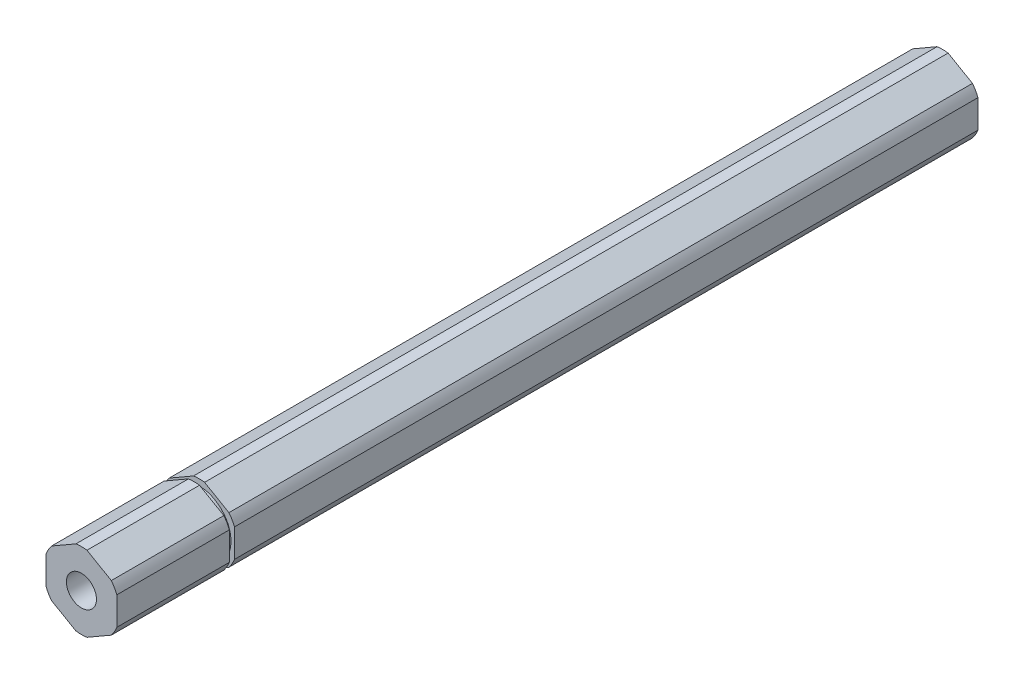
ISO-10303-21;
HEADER;
FILE_DESCRIPTION(('STEP AP214'),'2;1');
FILE_NAME('part.step','',(''),(''),'','','');
FILE_SCHEMA(('AUTOMOTIVE_DESIGN { 1 0 10303 214 1 1 1 1 }'));
ENDSEC;
DATA;
#1=APPLICATION_CONTEXT('core data for automotive mechanical design processes');
#2=APPLICATION_PROTOCOL_DEFINITION('international standard','automotive_design',2000,#1);
#3=PRODUCT_CONTEXT('',#1,'mechanical');
#4=PRODUCT('Part','Part','',(#3));
#5=PRODUCT_RELATED_PRODUCT_CATEGORY('part','',(#4));
#6=PRODUCT_DEFINITION_FORMATION('','',#4);
#7=PRODUCT_DEFINITION_CONTEXT('part definition',#1,'design');
#8=PRODUCT_DEFINITION('design','',#6,#7);
#9=PRODUCT_DEFINITION_SHAPE('','',#8);
#10=(LENGTH_UNIT() NAMED_UNIT(*) SI_UNIT(.MILLI.,.METRE.));
#11=(NAMED_UNIT(*) PLANE_ANGLE_UNIT() SI_UNIT($,.RADIAN.));
#12=(NAMED_UNIT(*) SI_UNIT($,.STERADIAN.) SOLID_ANGLE_UNIT());
#13=UNCERTAINTY_MEASURE_WITH_UNIT(LENGTH_MEASURE(1.E-05),#10,'distance_accuracy_value','');
#14=(GEOMETRIC_REPRESENTATION_CONTEXT(3) GLOBAL_UNCERTAINTY_ASSIGNED_CONTEXT((#13)) GLOBAL_UNIT_ASSIGNED_CONTEXT((#10,
#11,#12)) REPRESENTATION_CONTEXT('',''));
#15=CARTESIAN_POINT('',(0.,0.,0.));
#16=DIRECTION('',(0.,0.,1.));
#17=DIRECTION('',(1.,0.,0.));
#18=AXIS2_PLACEMENT_3D('',#15,#16,#17);
#19=CARTESIAN_POINT('',(4.7625,0.,57.88025));
#20=DIRECTION('',(-1.,0.,0.));
#21=DIRECTION('',(0.,-1.,0.));
#22=AXIS2_PLACEMENT_3D('',#19,#20,#21);
#23=PLANE('',#22);
#24=DIRECTION('',(0.,-1.,0.));
#25=VECTOR('',#24,1.);
#26=CARTESIAN_POINT('',(4.7625,0.,42.75455));
#27=LINE('',#26,#25);
#28=CARTESIAN_POINT('',(4.7625,1.89171391930704,42.75455));
#29=VERTEX_POINT('',#28);
#30=CARTESIAN_POINT('',(4.7625,-1.89171391930704,42.75455));
#31=VERTEX_POINT('',#30);
#32=EDGE_CURVE('E59',#29,#31,#27,.T.);
#33=ORIENTED_EDGE('',*,*,#32,.F.);
#34=DIRECTION('',(0.,0.,-1.));
#35=VECTOR('',#34,1.);
#36=CARTESIAN_POINT('',(4.7625,1.89171391930704,57.88025));
#37=LINE('',#36,#35);
#38=CARTESIAN_POINT('',(4.7625,1.89171391930704,57.88025));
#39=VERTEX_POINT('',#38);
#40=EDGE_CURVE('E201',#39,#29,#37,.T.);
#41=ORIENTED_EDGE('',*,*,#40,.F.);
#42=DIRECTION('',(0.,1.,0.));
#43=VECTOR('',#42,1.);
#44=CARTESIAN_POINT('',(4.7625,0.,57.88025));
#45=LINE('',#44,#43);
#46=CARTESIAN_POINT('',(4.7625,-1.89171391930704,57.88025));
#47=VERTEX_POINT('',#46);
#48=EDGE_CURVE('E372',#47,#39,#45,.T.);
#49=ORIENTED_EDGE('',*,*,#48,.F.);
#50=DIRECTION('',(0.,0.,-1.));
#51=VECTOR('',#50,1.);
#52=CARTESIAN_POINT('',(4.7625,-1.89171391930704,57.88025));
#53=LINE('',#52,#51);
#54=EDGE_CURVE('E215',#47,#31,#53,.T.);
#55=ORIENTED_EDGE('',*,*,#54,.T.);
#56=EDGE_LOOP('',(#33,#41,#49,#55));
#57=FACE_BOUND('',#56,.T.);
#58=ADVANCED_FACE('F37',(#57),#23,.F.);
#59=CARTESIAN_POINT('',(0.,0.,57.88025));
#60=DIRECTION('',(0.,0.,-1.));
#61=DIRECTION('',(-1.,0.,0.));
#62=AXIS2_PLACEMENT_3D('',#59,#60,#61);
#63=CYLINDRICAL_SURFACE('',#62,5.12445);
#64=CARTESIAN_POINT('',(0.,0.,42.75455));
#65=DIRECTION('',(0.,0.,-1.));
#66=DIRECTION('',(-1.,0.,0.));
#67=AXIS2_PLACEMENT_3D('',#64,#65,#66);
#68=CIRCLE('',#67,5.12445);
#69=CARTESIAN_POINT('',(4.01952231081252,3.17858902586987,42.75455));
#70=VERTEX_POINT('',#69);
#71=EDGE_CURVE('E361',#70,#29,#68,.T.);
#72=ORIENTED_EDGE('',*,*,#71,.F.);
#73=DIRECTION('',(0.,0.,-1.));
#74=VECTOR('',#73,1.);
#75=CARTESIAN_POINT('',(4.01952231081252,3.17858902586987,57.88025));
#76=LINE('',#75,#74);
#77=CARTESIAN_POINT('',(4.01952231081252,3.17858902586987,57.88025));
#78=VERTEX_POINT('',#77);
#79=EDGE_CURVE('E264',#78,#70,#76,.T.);
#80=ORIENTED_EDGE('',*,*,#79,.F.);
#81=CARTESIAN_POINT('',(0.,0.,57.88025));
#82=DIRECTION('',(0.,0.,1.));
#83=DIRECTION('',(1.,0.,0.));
#84=AXIS2_PLACEMENT_3D('',#81,#82,#83);
#85=CIRCLE('',#84,5.12445);
#86=EDGE_CURVE('E223',#39,#78,#85,.T.);
#87=ORIENTED_EDGE('',*,*,#86,.F.);
#88=ORIENTED_EDGE('',*,*,#40,.T.);
#89=EDGE_LOOP('',(#72,#80,#87,#88));
#90=FACE_BOUND('',#89,.T.);
#91=ADVANCED_FACE('F435',(#90),#63,.T.);
#92=CARTESIAN_POINT('',(2.38125,4.12444598552339,57.88025));
#93=DIRECTION('',(-0.5,-0.866025403784439,0.));
#94=DIRECTION('',(0.866025403784439,-0.5,0.));
#95=AXIS2_PLACEMENT_3D('',#92,#93,#94);
#96=PLANE('',#95);
#97=DIRECTION('',(0.866025403784439,-0.5,0.));
#98=VECTOR('',#97,1.);
#99=CARTESIAN_POINT('',(2.38125,4.12444598552339,42.75455));
#100=LINE('',#99,#98);
#101=CARTESIAN_POINT('',(0.742977689187476,5.07030294517691,42.75455));
#102=VERTEX_POINT('',#101);
#103=EDGE_CURVE('E359',#102,#70,#100,.T.);
#104=ORIENTED_EDGE('',*,*,#103,.F.);
#105=DIRECTION('',(0.,0.,-1.));
#106=VECTOR('',#105,1.);
#107=CARTESIAN_POINT('',(0.742977689187476,5.07030294517691,57.88025));
#108=LINE('',#107,#106);
#109=CARTESIAN_POINT('',(0.742977689187476,5.07030294517691,57.88025));
#110=VERTEX_POINT('',#109);
#111=EDGE_CURVE('E260',#110,#102,#108,.T.);
#112=ORIENTED_EDGE('',*,*,#111,.F.);
#113=DIRECTION('',(-0.866025403784439,0.5,0.));
#114=VECTOR('',#113,1.);
#115=CARTESIAN_POINT('',(2.38125,4.12444598552339,57.88025));
#116=LINE('',#115,#114);
#117=EDGE_CURVE('E375',#78,#110,#116,.T.);
#118=ORIENTED_EDGE('',*,*,#117,.F.);
#119=ORIENTED_EDGE('',*,*,#79,.T.);
#120=EDGE_LOOP('',(#104,#112,#118,#119));
#121=FACE_BOUND('',#120,.T.);
#122=ADVANCED_FACE('F438',(#121),#96,.F.);
#123=CARTESIAN_POINT('',(0.,0.,42.75455));
#124=DIRECTION('',(0.,0.,-1.));
#125=DIRECTION('',(-1.,0.,0.));
#126=AXIS2_PLACEMENT_3D('',#123,#124,#125);
#127=CIRCLE('',#126,5.12445);
#128=CARTESIAN_POINT('',(-0.742977689187478,5.07030294517691,42.75455));
#129=VERTEX_POINT('',#128);
#130=EDGE_CURVE('E357',#129,#102,#127,.T.);
#131=ORIENTED_EDGE('',*,*,#130,.F.);
#132=DIRECTION('',(0.,0.,-1.));
#133=VECTOR('',#132,1.);
#134=CARTESIAN_POINT('',(-0.742977689187479,5.07030294517691,57.88025));
#135=LINE('',#134,#133);
#136=CARTESIAN_POINT('',(-0.742977689187479,5.07030294517691,57.88025));
#137=VERTEX_POINT('',#136);
#138=EDGE_CURVE('E256',#137,#129,#135,.T.);
#139=ORIENTED_EDGE('',*,*,#138,.F.);
#140=EDGE_CURVE('E376',#110,#137,#85,.T.);
#141=ORIENTED_EDGE('',*,*,#140,.F.);
#142=ORIENTED_EDGE('',*,*,#111,.T.);
#143=EDGE_LOOP('',(#131,#139,#141,#142));
#144=FACE_BOUND('',#143,.T.);
#145=ADVANCED_FACE('F400',(#144),#63,.T.);
#146=CARTESIAN_POINT('',(-2.38125,4.12444598552339,57.88025));
#147=DIRECTION('',(0.5,-0.866025403784438,0.));
#148=DIRECTION('',(0.866025403784439,0.5,0.));
#149=AXIS2_PLACEMENT_3D('',#146,#147,#148);
#150=PLANE('',#149);
#151=DIRECTION('',(0.866025403784439,0.5,0.));
#152=VECTOR('',#151,1.);
#153=CARTESIAN_POINT('',(-2.38125,4.12444598552339,42.75455));
#154=LINE('',#153,#152);
#155=CARTESIAN_POINT('',(-4.01952231081252,3.17858902586987,42.75455));
#156=VERTEX_POINT('',#155);
#157=EDGE_CURVE('E355',#156,#129,#154,.T.);
#158=ORIENTED_EDGE('',*,*,#157,.F.);
#159=DIRECTION('',(0.,0.,-1.));
#160=VECTOR('',#159,1.);
#161=CARTESIAN_POINT('',(-4.01952231081252,3.17858902586987,57.88025));
#162=LINE('',#161,#160);
#163=CARTESIAN_POINT('',(-4.01952231081252,3.17858902586987,57.88025));
#164=VERTEX_POINT('',#163);
#165=EDGE_CURVE('E252',#164,#156,#162,.T.);
#166=ORIENTED_EDGE('',*,*,#165,.F.);
#167=DIRECTION('',(-0.866025403784438,-0.5,0.));
#168=VECTOR('',#167,1.);
#169=CARTESIAN_POINT('',(-2.38125,4.12444598552339,57.88025));
#170=LINE('',#169,#168);
#171=EDGE_CURVE('E378',#137,#164,#170,.T.);
#172=ORIENTED_EDGE('',*,*,#171,.F.);
#173=ORIENTED_EDGE('',*,*,#138,.T.);
#174=EDGE_LOOP('',(#158,#166,#172,#173));
#175=FACE_BOUND('',#174,.T.);
#176=ADVANCED_FACE('F403',(#175),#150,.F.);
#177=CARTESIAN_POINT('',(0.,0.,42.75455));
#178=DIRECTION('',(0.,0.,-1.));
#179=DIRECTION('',(-1.,0.,0.));
#180=AXIS2_PLACEMENT_3D('',#177,#178,#179);
#181=CIRCLE('',#180,5.12445);
#182=CARTESIAN_POINT('',(-4.7625,1.89171391930703,42.75455));
#183=VERTEX_POINT('',#182);
#184=EDGE_CURVE('E353',#183,#156,#181,.T.);
#185=ORIENTED_EDGE('',*,*,#184,.F.);
#186=DIRECTION('',(0.,0.,-1.));
#187=VECTOR('',#186,1.);
#188=CARTESIAN_POINT('',(-4.7625,1.89171391930703,57.88025));
#189=LINE('',#188,#187);
#190=CARTESIAN_POINT('',(-4.7625,1.89171391930703,57.88025));
#191=VERTEX_POINT('',#190);
#192=EDGE_CURVE('E248',#191,#183,#189,.T.);
#193=ORIENTED_EDGE('',*,*,#192,.F.);
#194=EDGE_CURVE('E380',#164,#191,#85,.T.);
#195=ORIENTED_EDGE('',*,*,#194,.F.);
#196=ORIENTED_EDGE('',*,*,#165,.T.);
#197=EDGE_LOOP('',(#185,#193,#195,#196));
#198=FACE_BOUND('',#197,.T.);
#199=ADVANCED_FACE('F406',(#198),#63,.T.);
#200=CARTESIAN_POINT('',(-4.7625,0.,57.88025));
#201=DIRECTION('',(1.,0.,0.));
#202=DIRECTION('',(0.,1.,0.));
#203=AXIS2_PLACEMENT_3D('',#200,#201,#202);
#204=PLANE('',#203);
#205=DIRECTION('',(0.,1.,0.));
#206=VECTOR('',#205,1.);
#207=CARTESIAN_POINT('',(-4.7625,0.,42.75455));
#208=LINE('',#207,#206);
#209=CARTESIAN_POINT('',(-4.7625,-1.89171391930704,42.75455));
#210=VERTEX_POINT('',#209);
#211=EDGE_CURVE('E351',#210,#183,#208,.T.);
#212=ORIENTED_EDGE('',*,*,#211,.F.);
#213=DIRECTION('',(0.,0.,-1.));
#214=VECTOR('',#213,1.);
#215=CARTESIAN_POINT('',(-4.7625,-1.89171391930704,57.88025));
#216=LINE('',#215,#214);
#217=CARTESIAN_POINT('',(-4.7625,-1.89171391930704,57.88025));
#218=VERTEX_POINT('',#217);
#219=EDGE_CURVE('E244',#218,#210,#216,.T.);
#220=ORIENTED_EDGE('',*,*,#219,.F.);
#221=DIRECTION('',(0.,-1.,0.));
#222=VECTOR('',#221,1.);
#223=CARTESIAN_POINT('',(-4.7625,0.,57.88025));
#224=LINE('',#223,#222);
#225=EDGE_CURVE('E381',#191,#218,#224,.T.);
#226=ORIENTED_EDGE('',*,*,#225,.F.);
#227=ORIENTED_EDGE('',*,*,#192,.T.);
#228=EDGE_LOOP('',(#212,#220,#226,#227));
#229=FACE_BOUND('',#228,.T.);
#230=ADVANCED_FACE('F411',(#229),#204,.F.);
#231=CARTESIAN_POINT('',(0.,0.,42.75455));
#232=DIRECTION('',(0.,0.,-1.));
#233=DIRECTION('',(-1.,0.,0.));
#234=AXIS2_PLACEMENT_3D('',#231,#232,#233);
#235=CIRCLE('',#234,5.12445);
#236=CARTESIAN_POINT('',(-4.01952231081252,-3.17858902586988,42.75455));
#237=VERTEX_POINT('',#236);
#238=EDGE_CURVE('E349',#237,#210,#235,.T.);
#239=ORIENTED_EDGE('',*,*,#238,.F.);
#240=DIRECTION('',(0.,0.,-1.));
#241=VECTOR('',#240,1.);
#242=CARTESIAN_POINT('',(-4.01952231081252,-3.17858902586988,57.88025));
#243=LINE('',#242,#241);
#244=CARTESIAN_POINT('',(-4.01952231081252,-3.17858902586988,57.88025));
#245=VERTEX_POINT('',#244);
#246=EDGE_CURVE('E240',#245,#237,#243,.T.);
#247=ORIENTED_EDGE('',*,*,#246,.F.);
#248=EDGE_CURVE('E382',#218,#245,#85,.T.);
#249=ORIENTED_EDGE('',*,*,#248,.F.);
#250=ORIENTED_EDGE('',*,*,#219,.T.);
#251=EDGE_LOOP('',(#239,#247,#249,#250));
#252=FACE_BOUND('',#251,.T.);
#253=ADVANCED_FACE('F414',(#252),#63,.T.);
#254=CARTESIAN_POINT('',(-2.38125,-4.12444598552339,57.88025));
#255=DIRECTION('',(0.5,0.866025403784439,0.));
#256=DIRECTION('',(-0.866025403784439,0.5,0.));
#257=AXIS2_PLACEMENT_3D('',#254,#255,#256);
#258=PLANE('',#257);
#259=DIRECTION('',(-0.866025403784439,0.5,0.));
#260=VECTOR('',#259,1.);
#261=CARTESIAN_POINT('',(-2.38125,-4.12444598552339,42.75455));
#262=LINE('',#261,#260);
#263=CARTESIAN_POINT('',(-0.742977689187483,-5.07030294517691,42.75455));
#264=VERTEX_POINT('',#263);
#265=EDGE_CURVE('E347',#264,#237,#262,.T.);
#266=ORIENTED_EDGE('',*,*,#265,.F.);
#267=DIRECTION('',(0.,0.,-1.));
#268=VECTOR('',#267,1.);
#269=CARTESIAN_POINT('',(-0.742977689187483,-5.07030294517691,57.88025));
#270=LINE('',#269,#268);
#271=CARTESIAN_POINT('',(-0.742977689187483,-5.07030294517691,57.88025));
#272=VERTEX_POINT('',#271);
#273=EDGE_CURVE('E236',#272,#264,#270,.T.);
#274=ORIENTED_EDGE('',*,*,#273,.F.);
#275=DIRECTION('',(0.866025403784439,-0.5,0.));
#276=VECTOR('',#275,1.);
#277=CARTESIAN_POINT('',(-2.38125,-4.12444598552339,57.88025));
#278=LINE('',#277,#276);
#279=EDGE_CURVE('E383',#245,#272,#278,.T.);
#280=ORIENTED_EDGE('',*,*,#279,.F.);
#281=ORIENTED_EDGE('',*,*,#246,.T.);
#282=EDGE_LOOP('',(#266,#274,#280,#281));
#283=FACE_BOUND('',#282,.T.);
#284=ADVANCED_FACE('F417',(#283),#258,.F.);
#285=CARTESIAN_POINT('',(0.,0.,42.75455));
#286=DIRECTION('',(0.,0.,-1.));
#287=DIRECTION('',(-1.,0.,0.));
#288=AXIS2_PLACEMENT_3D('',#285,#286,#287);
#289=CIRCLE('',#288,5.12445);
#290=CARTESIAN_POINT('',(0.742977689187482,-5.07030294517691,42.75455));
#291=VERTEX_POINT('',#290);
#292=EDGE_CURVE('E345',#291,#264,#289,.T.);
#293=ORIENTED_EDGE('',*,*,#292,.F.);
#294=DIRECTION('',(0.,0.,-1.));
#295=VECTOR('',#294,1.);
#296=CARTESIAN_POINT('',(0.742977689187482,-5.07030294517691,57.88025));
#297=LINE('',#296,#295);
#298=CARTESIAN_POINT('',(0.742977689187482,-5.07030294517691,57.88025));
#299=VERTEX_POINT('',#298);
#300=EDGE_CURVE('E232',#299,#291,#297,.T.);
#301=ORIENTED_EDGE('',*,*,#300,.F.);
#302=EDGE_CURVE('E222',#272,#299,#85,.T.);
#303=ORIENTED_EDGE('',*,*,#302,.F.);
#304=ORIENTED_EDGE('',*,*,#273,.T.);
#305=EDGE_LOOP('',(#293,#301,#303,#304));
#306=FACE_BOUND('',#305,.T.);
#307=ADVANCED_FACE('F422',(#306),#63,.T.);
#308=CARTESIAN_POINT('',(2.38125,-4.12444598552339,57.88025));
#309=DIRECTION('',(-0.5,0.866025403784438,0.));
#310=DIRECTION('',(-0.866025403784438,-0.500000000000001,0.));
#311=AXIS2_PLACEMENT_3D('',#308,#309,#310);
#312=PLANE('',#311);
#313=DIRECTION('',(-0.866025403784438,-0.500000000000001,0.));
#314=VECTOR('',#313,1.);
#315=CARTESIAN_POINT('',(2.38125,-4.12444598552339,42.75455));
#316=LINE('',#315,#314);
#317=CARTESIAN_POINT('',(4.01952231081252,-3.17858902586987,42.75455));
#318=VERTEX_POINT('',#317);
#319=EDGE_CURVE('E208',#318,#291,#316,.T.);
#320=ORIENTED_EDGE('',*,*,#319,.F.);
#321=DIRECTION('',(0.,0.,-1.));
#322=VECTOR('',#321,1.);
#323=CARTESIAN_POINT('',(4.01952231081252,-3.17858902586987,57.88025));
#324=LINE('',#323,#322);
#325=CARTESIAN_POINT('',(4.01952231081252,-3.17858902586987,57.88025));
#326=VERTEX_POINT('',#325);
#327=EDGE_CURVE('E228',#326,#318,#324,.T.);
#328=ORIENTED_EDGE('',*,*,#327,.F.);
#329=DIRECTION('',(0.866025403784438,0.500000000000001,0.));
#330=VECTOR('',#329,1.);
#331=CARTESIAN_POINT('',(2.38125,-4.12444598552339,57.88025));
#332=LINE('',#331,#330);
#333=EDGE_CURVE('E220',#299,#326,#332,.T.);
#334=ORIENTED_EDGE('',*,*,#333,.F.);
#335=ORIENTED_EDGE('',*,*,#300,.T.);
#336=EDGE_LOOP('',(#320,#328,#334,#335));
#337=FACE_BOUND('',#336,.T.);
#338=ADVANCED_FACE('F429',(#337),#312,.F.);
#339=CARTESIAN_POINT('',(0.,0.,42.75455));
#340=DIRECTION('',(0.,0.,-1.));
#341=DIRECTION('',(-1.,0.,0.));
#342=AXIS2_PLACEMENT_3D('',#339,#340,#341);
#343=CIRCLE('',#342,5.12445);
#344=EDGE_CURVE('E11',#31,#318,#343,.T.);
#345=ORIENTED_EDGE('',*,*,#344,.F.);
#346=ORIENTED_EDGE('',*,*,#54,.F.);
#347=EDGE_CURVE('E216',#326,#47,#85,.T.);
#348=ORIENTED_EDGE('',*,*,#347,.F.);
#349=ORIENTED_EDGE('',*,*,#327,.T.);
#350=EDGE_LOOP('',(#345,#346,#348,#349));
#351=FACE_BOUND('',#350,.T.);
#352=ADVANCED_FACE('F431',(#351),#63,.T.);
#353=CARTESIAN_POINT('',(0.,0.,57.88025));
#354=DIRECTION('',(0.,0.,1.));
#355=DIRECTION('',(1.,0.,0.));
#356=AXIS2_PLACEMENT_3D('',#353,#354,#355);
#357=PLANE('',#356);
#358=CARTESIAN_POINT('',(0.,0.,57.88025));
#359=DIRECTION('',(0.,0.,-1.));
#360=DIRECTION('',(-1.,0.,0.));
#361=AXIS2_PLACEMENT_3D('',#358,#359,#360);
#362=CIRCLE('',#361,2.0193);
#363=CARTESIAN_POINT('',(2.0193,0.,57.88025));
#364=VERTEX_POINT('',#363);
#365=EDGE_CURVE('E364',#364,#364,#362,.T.);
#366=ORIENTED_EDGE('',*,*,#365,.T.);
#367=EDGE_LOOP('',(#366));
#368=FACE_BOUND('',#367,.T.);
#369=ORIENTED_EDGE('',*,*,#48,.T.);
#370=ORIENTED_EDGE('',*,*,#86,.T.);
#371=ORIENTED_EDGE('',*,*,#117,.T.);
#372=ORIENTED_EDGE('',*,*,#140,.T.);
#373=ORIENTED_EDGE('',*,*,#171,.T.);
#374=ORIENTED_EDGE('',*,*,#194,.T.);
#375=ORIENTED_EDGE('',*,*,#225,.T.);
#376=ORIENTED_EDGE('',*,*,#248,.T.);
#377=ORIENTED_EDGE('',*,*,#279,.T.);
#378=ORIENTED_EDGE('',*,*,#302,.T.);
#379=ORIENTED_EDGE('',*,*,#333,.T.);
#380=ORIENTED_EDGE('',*,*,#347,.T.);
#381=EDGE_LOOP('',(#369,#370,#371,#372,#373,#374,#375,#376,#377,#378,#379,#380));
#382=FACE_BOUND('',#381,.T.);
#383=ADVANCED_FACE('F393',(#368,#382),#357,.T.);
#384=CARTESIAN_POINT('',(0.,0.,38.83025));
#385=DIRECTION('',(0.,0.,1.));
#386=DIRECTION('',(1.,0.,0.));
#387=AXIS2_PLACEMENT_3D('',#384,#385,#386);
#388=CYLINDRICAL_SURFACE('',#387,2.0193);
#389=CARTESIAN_POINT('',(0.,0.,38.83025));
#390=DIRECTION('',(0.,0.,-1.));
#391=DIRECTION('',(-1.,0.,0.));
#392=AXIS2_PLACEMENT_3D('',#389,#390,#391);
#393=CIRCLE('',#392,2.0193);
#394=CARTESIAN_POINT('',(2.0193,0.,38.83025));
#395=VERTEX_POINT('',#394);
#396=EDGE_CURVE('E365',#395,#395,#393,.T.);
#397=CARTESIAN_POINT('',(2.0193,0.,38.83025));
#398=CARTESIAN_POINT('',(2.0193,0.,39.0286875));
#399=CARTESIAN_POINT('',(2.0193,0.,39.227125));
#400=CARTESIAN_POINT('',(2.0193,0.,39.624));
#401=CARTESIAN_POINT('',(2.0193,0.,39.8224375));
#402=CARTESIAN_POINT('',(2.0193,0.,40.2193125));
#403=CARTESIAN_POINT('',(2.0193,0.,40.41775));
#404=CARTESIAN_POINT('',(2.0193,0.,40.814625));
#405=CARTESIAN_POINT('',(2.0193,0.,41.0130625));
#406=CARTESIAN_POINT('',(2.0193,0.,41.4099375));
#407=CARTESIAN_POINT('',(2.0193,0.,41.608375));
#408=CARTESIAN_POINT('',(2.0193,0.,42.00525));
#409=CARTESIAN_POINT('',(2.0193,0.,42.2036875));
#410=CARTESIAN_POINT('',(2.0193,0.,42.6005625));
#411=CARTESIAN_POINT('',(2.0193,0.,42.799));
#412=CARTESIAN_POINT('',(2.0193,0.,43.195875));
#413=CARTESIAN_POINT('',(2.0193,0.,43.3943125));
#414=CARTESIAN_POINT('',(2.0193,0.,43.7911875));
#415=CARTESIAN_POINT('',(2.0193,0.,43.989625));
#416=CARTESIAN_POINT('',(2.0193,0.,44.3865));
#417=CARTESIAN_POINT('',(2.0193,0.,44.5849375));
#418=CARTESIAN_POINT('',(2.0193,0.,44.9818125));
#419=CARTESIAN_POINT('',(2.0193,0.,45.18025));
#420=CARTESIAN_POINT('',(2.0193,0.,45.577125));
#421=CARTESIAN_POINT('',(2.0193,0.,45.7755625));
#422=CARTESIAN_POINT('',(2.0193,0.,46.1724375));
#423=CARTESIAN_POINT('',(2.0193,0.,46.370875));
#424=CARTESIAN_POINT('',(2.0193,0.,46.76775));
#425=CARTESIAN_POINT('',(2.0193,0.,46.9661875));
#426=CARTESIAN_POINT('',(2.0193,0.,47.3630625));
#427=CARTESIAN_POINT('',(2.0193,0.,47.5615));
#428=CARTESIAN_POINT('',(2.0193,0.,47.958375));
#429=CARTESIAN_POINT('',(2.0193,0.,48.1568125));
#430=CARTESIAN_POINT('',(2.0193,0.,48.5536875));
#431=CARTESIAN_POINT('',(2.0193,0.,48.752125));
#432=CARTESIAN_POINT('',(2.0193,0.,49.149));
#433=CARTESIAN_POINT('',(2.0193,0.,49.3474375));
#434=CARTESIAN_POINT('',(2.0193,0.,49.7443125));
#435=CARTESIAN_POINT('',(2.0193,0.,49.94275));
#436=CARTESIAN_POINT('',(2.0193,0.,50.339625));
#437=CARTESIAN_POINT('',(2.0193,0.,50.5380625));
#438=CARTESIAN_POINT('',(2.0193,0.,50.9349375));
#439=CARTESIAN_POINT('',(2.0193,0.,51.133375));
#440=CARTESIAN_POINT('',(2.0193,0.,51.53025));
#441=CARTESIAN_POINT('',(2.0193,0.,51.7286875));
#442=CARTESIAN_POINT('',(2.0193,0.,52.1255625));
#443=CARTESIAN_POINT('',(2.0193,0.,52.324));
#444=CARTESIAN_POINT('',(2.0193,0.,52.720875));
#445=CARTESIAN_POINT('',(2.0193,0.,52.9193125));
#446=CARTESIAN_POINT('',(2.0193,0.,53.3161875));
#447=CARTESIAN_POINT('',(2.0193,0.,53.514625));
#448=CARTESIAN_POINT('',(2.0193,0.,53.9115));
#449=CARTESIAN_POINT('',(2.0193,0.,54.1099375));
#450=CARTESIAN_POINT('',(2.0193,0.,54.5068125));
#451=CARTESIAN_POINT('',(2.0193,0.,54.70525));
#452=CARTESIAN_POINT('',(2.0193,0.,55.102125));
#453=CARTESIAN_POINT('',(2.0193,0.,55.3005625));
#454=CARTESIAN_POINT('',(2.0193,0.,55.6974375));
#455=CARTESIAN_POINT('',(2.0193,0.,55.895875));
#456=CARTESIAN_POINT('',(2.0193,0.,56.29275));
#457=CARTESIAN_POINT('',(2.0193,0.,56.4911875));
#458=CARTESIAN_POINT('',(2.0193,0.,56.8880625));
#459=CARTESIAN_POINT('',(2.0193,0.,57.0865));
#460=CARTESIAN_POINT('',(2.0193,0.,57.483375));
#461=CARTESIAN_POINT('',(2.0193,0.,57.6818125));
#462=CARTESIAN_POINT('',(2.0193,0.,57.88025));
#463=B_SPLINE_CURVE_WITH_KNOTS('',3,(#397,#398,#399,#400,#401,#402,#403,#404,#405,#406,#407,
#408,#409,#410,#411,#412,#413,#414,#415,#416,#417,#418,#419,#420,#421,#422,#423,#424,#425,#426,
#427,#428,#429,#430,#431,#432,#433,#434,#435,#436,#437,#438,#439,#440,#441,#442,#443,#444,#445,
#446,#447,#448,#449,#450,#451,#452,#453,#454,#455,#456,#457,#458,#459,#460,#461,#462),
.UNSPECIFIED.,.F.,.F.,(4,2,2,2,2,2,2,2,2,2,2,2,2,2,2,2,2,2,2,2,2,2,2,2,2,2,2,2,2,2,2,2,4),(0.,
0.5953125,1.190625,1.7859375,2.38125,2.9765625,3.571875,4.1671875,4.7625,5.3578125,5.953125,
6.5484375,7.14375,7.7390625,8.334375,8.92968750000001,9.52500000000001,10.1203125,10.715625,
11.3109375,11.90625,12.5015625,13.096875,13.6921875,14.2875,14.8828125,15.478125,16.0734375,
16.66875,17.2640625,17.859375,18.4546875,19.05),.UNSPECIFIED.);
#464=EDGE_CURVE('BSEAM451',#395,#364,#463,.T.);
#465=ORIENTED_EDGE('',*,*,#396,.T.);
#466=ORIENTED_EDGE('',*,*,#365,.F.);
#467=ORIENTED_EDGE('',*,*,#464,.T.);
#468=ORIENTED_EDGE('',*,*,#464,.F.);
#469=EDGE_LOOP('',(#465,#467,#466,#468));
#470=FACE_BOUND('',#469,.T.);
#471=ADVANCED_FACE('F451',(#470),#388,.F.);
#472=CARTESIAN_POINT('',(0.,0.,38.83025));
#473=DIRECTION('',(0.,0.,1.));
#474=DIRECTION('',(-1.,0.,0.));
#475=AXIS2_PLACEMENT_3D('',#472,#473,#474);
#476=PLANE('',#475);
#477=ORIENTED_EDGE('',*,*,#396,.F.);
#478=EDGE_LOOP('',(#477));
#479=FACE_BOUND('',#478,.T.);
#480=ADVANCED_FACE('F441',(#479),#476,.T.);
#481=CARTESIAN_POINT('',(0.,0.,42.75455));
#482=DIRECTION('',(0.,0.,-1.));
#483=DIRECTION('',(-1.,0.,0.));
#484=AXIS2_PLACEMENT_3D('',#481,#482,#483);
#485=PLANE('',#484);
#486=CARTESIAN_POINT('',(0.,0.,42.75455));
#487=DIRECTION('',(0.,0.,-1.));
#488=DIRECTION('',(-1.,0.,0.));
#489=AXIS2_PLACEMENT_3D('',#486,#487,#488);
#490=CIRCLE('',#489,4.2926);
#491=CARTESIAN_POINT('',(-4.2926,0.,42.75455));
#492=VERTEX_POINT('',#491);
#493=EDGE_CURVE('E534',#492,#492,#490,.T.);
#494=ORIENTED_EDGE('',*,*,#493,.F.);
#495=EDGE_LOOP('',(#494));
#496=FACE_BOUND('',#495,.T.);
#497=ORIENTED_EDGE('',*,*,#32,.T.);
#498=ORIENTED_EDGE('',*,*,#344,.T.);
#499=ORIENTED_EDGE('',*,*,#319,.T.);
#500=ORIENTED_EDGE('',*,*,#292,.T.);
#501=ORIENTED_EDGE('',*,*,#265,.T.);
#502=ORIENTED_EDGE('',*,*,#238,.T.);
#503=ORIENTED_EDGE('',*,*,#211,.T.);
#504=ORIENTED_EDGE('',*,*,#184,.T.);
#505=ORIENTED_EDGE('',*,*,#157,.T.);
#506=ORIENTED_EDGE('',*,*,#130,.T.);
#507=ORIENTED_EDGE('',*,*,#103,.T.);
#508=ORIENTED_EDGE('',*,*,#71,.T.);
#509=EDGE_LOOP('',(#497,#498,#499,#500,#501,#502,#503,#504,#505,#506,#507,#508));
#510=FACE_BOUND('',#509,.T.);
#511=ADVANCED_FACE('F439',(#496,#510),#485,.T.);
#512=CARTESIAN_POINT('',(0.,0.,42.06875));
#513=DIRECTION('',(0.,0.,-1.));
#514=DIRECTION('',(-1.,0.,0.));
#515=AXIS2_PLACEMENT_3D('',#512,#513,#514);
#516=PLANE('',#515);
#517=CARTESIAN_POINT('',(0.,0.,42.06875));
#518=DIRECTION('',(0.,0.,-1.));
#519=DIRECTION('',(-1.,0.,0.));
#520=AXIS2_PLACEMENT_3D('',#517,#518,#519);
#521=CIRCLE('',#520,4.2926);
#522=CARTESIAN_POINT('',(-4.2926,0.,42.06875));
#523=VERTEX_POINT('',#522);
#524=EDGE_CURVE('E535',#523,#523,#521,.T.);
#525=ORIENTED_EDGE('',*,*,#524,.T.);
#526=EDGE_LOOP('',(#525));
#527=FACE_BOUND('',#526,.T.);
#528=CARTESIAN_POINT('',(0.,0.,42.06875));
#529=DIRECTION('',(0.,0.,-1.));
#530=DIRECTION('',(-1.,0.,0.));
#531=AXIS2_PLACEMENT_3D('',#528,#529,#530);
#532=CIRCLE('',#531,5.12445);
#533=CARTESIAN_POINT('',(4.01952231081252,3.17858902586987,42.06875));
#534=VERTEX_POINT('',#533);
#535=CARTESIAN_POINT('',(4.7625,1.89171391930704,42.06875));
#536=VERTEX_POINT('',#535);
#537=EDGE_CURVE('E209',#534,#536,#532,.T.);
#538=ORIENTED_EDGE('',*,*,#537,.F.);
#539=DIRECTION('',(0.866025403784439,-0.5,0.));
#540=VECTOR('',#539,1.);
#541=CARTESIAN_POINT('',(2.38125,4.12444598552339,42.06875));
#542=LINE('',#541,#540);
#543=CARTESIAN_POINT('',(0.742977689187476,5.07030294517691,42.06875));
#544=VERTEX_POINT('',#543);
#545=EDGE_CURVE('E335',#544,#534,#542,.T.);
#546=ORIENTED_EDGE('',*,*,#545,.F.);
#547=CARTESIAN_POINT('',(0.,0.,42.06875));
#548=DIRECTION('',(0.,0.,-1.));
#549=DIRECTION('',(-1.,0.,0.));
#550=AXIS2_PLACEMENT_3D('',#547,#548,#549);
#551=CIRCLE('',#550,5.12445);
#552=CARTESIAN_POINT('',(-0.742977689187478,5.07030294517691,42.06875));
#553=VERTEX_POINT('',#552);
#554=EDGE_CURVE('E332',#553,#544,#551,.T.);
#555=ORIENTED_EDGE('',*,*,#554,.F.);
#556=DIRECTION('',(0.866025403784439,0.5,0.));
#557=VECTOR('',#556,1.);
#558=CARTESIAN_POINT('',(-2.38125,4.12444598552339,42.06875));
#559=LINE('',#558,#557);
#560=CARTESIAN_POINT('',(-4.01952231081252,3.17858902586987,42.06875));
#561=VERTEX_POINT('',#560);
#562=EDGE_CURVE('E330',#561,#553,#559,.T.);
#563=ORIENTED_EDGE('',*,*,#562,.F.);
#564=CARTESIAN_POINT('',(0.,0.,42.06875));
#565=DIRECTION('',(0.,0.,-1.));
#566=DIRECTION('',(-1.,0.,0.));
#567=AXIS2_PLACEMENT_3D('',#564,#565,#566);
#568=CIRCLE('',#567,5.12445);
#569=CARTESIAN_POINT('',(-4.7625,1.89171391930703,42.06875));
#570=VERTEX_POINT('',#569);
#571=EDGE_CURVE('E333',#570,#561,#568,.T.);
#572=ORIENTED_EDGE('',*,*,#571,.F.);
#573=DIRECTION('',(0.,1.,0.));
#574=VECTOR('',#573,1.);
#575=CARTESIAN_POINT('',(-4.7625,0.,42.06875));
#576=LINE('',#575,#574);
#577=CARTESIAN_POINT('',(-4.7625,-1.89171391930704,42.06875));
#578=VERTEX_POINT('',#577);
#579=EDGE_CURVE('E337',#578,#570,#576,.T.);
#580=ORIENTED_EDGE('',*,*,#579,.F.);
#581=CARTESIAN_POINT('',(0.,0.,42.06875));
#582=DIRECTION('',(0.,0.,-1.));
#583=DIRECTION('',(-1.,0.,0.));
#584=AXIS2_PLACEMENT_3D('',#581,#582,#583);
#585=CIRCLE('',#584,5.12445);
#586=CARTESIAN_POINT('',(-4.01952231081252,-3.17858902586988,42.06875));
#587=VERTEX_POINT('',#586);
#588=EDGE_CURVE('E525',#587,#578,#585,.T.);
#589=ORIENTED_EDGE('',*,*,#588,.F.);
#590=DIRECTION('',(-0.866025403784439,0.5,0.));
#591=VECTOR('',#590,1.);
#592=CARTESIAN_POINT('',(-2.38125,-4.12444598552339,42.06875));
#593=LINE('',#592,#591);
#594=CARTESIAN_POINT('',(-0.742977689187483,-5.07030294517691,42.06875));
#595=VERTEX_POINT('',#594);
#596=EDGE_CURVE('E524',#595,#587,#593,.T.);
#597=ORIENTED_EDGE('',*,*,#596,.F.);
#598=CARTESIAN_POINT('',(0.,0.,42.06875));
#599=DIRECTION('',(0.,0.,-1.));
#600=DIRECTION('',(-1.,0.,0.));
#601=AXIS2_PLACEMENT_3D('',#598,#599,#600);
#602=CIRCLE('',#601,5.12445);
#603=CARTESIAN_POINT('',(0.742977689187482,-5.07030294517691,42.06875));
#604=VERTEX_POINT('',#603);
#605=EDGE_CURVE('E522',#604,#595,#602,.T.);
#606=ORIENTED_EDGE('',*,*,#605,.F.);
#607=DIRECTION('',(-0.866025403784438,-0.500000000000001,0.));
#608=VECTOR('',#607,1.);
#609=CARTESIAN_POINT('',(2.38125,-4.12444598552339,42.06875));
#610=LINE('',#609,#608);
#611=CARTESIAN_POINT('',(4.01952231081252,-3.17858902586987,42.06875));
#612=VERTEX_POINT('',#611);
#613=EDGE_CURVE('E52',#612,#604,#610,.T.);
#614=ORIENTED_EDGE('',*,*,#613,.F.);
#615=CARTESIAN_POINT('',(0.,0.,42.06875));
#616=DIRECTION('',(0.,0.,-1.));
#617=DIRECTION('',(-1.,0.,0.));
#618=AXIS2_PLACEMENT_3D('',#615,#616,#617);
#619=CIRCLE('',#618,5.12445);
#620=CARTESIAN_POINT('',(4.7625,-1.89171391930704,42.06875));
#621=VERTEX_POINT('',#620);
#622=EDGE_CURVE('E45',#621,#612,#619,.T.);
#623=ORIENTED_EDGE('',*,*,#622,.F.);
#624=DIRECTION('',(0.,-1.,0.));
#625=VECTOR('',#624,1.);
#626=CARTESIAN_POINT('',(4.7625,0.,42.06875));
#627=LINE('',#626,#625);
#628=EDGE_CURVE('E196',#536,#621,#627,.T.);
#629=ORIENTED_EDGE('',*,*,#628,.F.);
#630=EDGE_LOOP('',(#538,#546,#555,#563,#572,#580,#589,#597,#606,#614,#623,#629));
#631=FACE_BOUND('',#630,.T.);
#632=ADVANCED_FACE('F195',(#527,#631),#516,.F.);
#633=CARTESIAN_POINT('',(0.,0.,42.75455));
#634=DIRECTION('',(0.,0.,-1.));
#635=DIRECTION('',(-1.,0.,0.));
#636=AXIS2_PLACEMENT_3D('',#633,#634,#635);
#637=CYLINDRICAL_SURFACE('',#636,4.2926);
#638=ORIENTED_EDGE('',*,*,#493,.T.);
#639=EDGE_LOOP('',(#638));
#640=FACE_BOUND('',#639,.T.);
#641=ORIENTED_EDGE('',*,*,#524,.F.);
#642=EDGE_LOOP('',(#641));
#643=FACE_BOUND('',#642,.T.);
#644=ADVANCED_FACE('F448',(#640,#643),#637,.T.);
#645=CARTESIAN_POINT('',(0.,0.,-38.83025));
#646=DIRECTION('',(0.,0.,-1.));
#647=DIRECTION('',(-1.,0.,0.));
#648=AXIS2_PLACEMENT_3D('',#645,#646,#647);
#649=PLANE('',#648);
#650=CARTESIAN_POINT('',(0.,0.,-38.83025));
#651=DIRECTION('',(0.,0.,-1.));
#652=DIRECTION('',(-1.,0.,0.));
#653=AXIS2_PLACEMENT_3D('',#650,#651,#652);
#654=CIRCLE('',#653,2.0193);
#655=CARTESIAN_POINT('',(-2.0193,0.,-38.83025));
#656=VERTEX_POINT('',#655);
#657=EDGE_CURVE('E286',#656,#656,#654,.T.);
#658=ORIENTED_EDGE('',*,*,#657,.T.);
#659=EDGE_LOOP('',(#658));
#660=FACE_BOUND('',#659,.T.);
#661=ADVANCED_FACE('F542',(#660),#649,.T.);
#662=CARTESIAN_POINT('',(0.,0.,-38.83025));
#663=DIRECTION('',(0.,0.,-1.));
#664=DIRECTION('',(-1.,0.,0.));
#665=AXIS2_PLACEMENT_3D('',#662,#663,#664);
#666=CYLINDRICAL_SURFACE('',#665,2.0193);
#667=CARTESIAN_POINT('',(0.,0.,-57.88025));
#668=DIRECTION('',(0.,0.,-1.));
#669=DIRECTION('',(-1.,0.,0.));
#670=AXIS2_PLACEMENT_3D('',#667,#668,#669);
#671=CIRCLE('',#670,2.0193);
#672=CARTESIAN_POINT('',(-2.0193,0.,-57.88025));
#673=VERTEX_POINT('',#672);
#674=EDGE_CURVE('E289',#673,#673,#671,.T.);
#675=CARTESIAN_POINT('',(-2.0193,0.,-38.83025));
#676=CARTESIAN_POINT('',(-2.0193,0.,-39.0286875));
#677=CARTESIAN_POINT('',(-2.0193,0.,-39.227125));
#678=CARTESIAN_POINT('',(-2.0193,0.,-39.624));
#679=CARTESIAN_POINT('',(-2.0193,0.,-39.8224375));
#680=CARTESIAN_POINT('',(-2.0193,0.,-40.2193125));
#681=CARTESIAN_POINT('',(-2.0193,0.,-40.41775));
#682=CARTESIAN_POINT('',(-2.0193,0.,-40.814625));
#683=CARTESIAN_POINT('',(-2.0193,0.,-41.0130625));
#684=CARTESIAN_POINT('',(-2.0193,0.,-41.4099375));
#685=CARTESIAN_POINT('',(-2.0193,0.,-41.608375));
#686=CARTESIAN_POINT('',(-2.0193,0.,-42.00525));
#687=CARTESIAN_POINT('',(-2.0193,0.,-42.2036875));
#688=CARTESIAN_POINT('',(-2.0193,0.,-42.6005625));
#689=CARTESIAN_POINT('',(-2.0193,0.,-42.799));
#690=CARTESIAN_POINT('',(-2.0193,0.,-43.195875));
#691=CARTESIAN_POINT('',(-2.0193,0.,-43.3943125));
#692=CARTESIAN_POINT('',(-2.0193,0.,-43.7911875));
#693=CARTESIAN_POINT('',(-2.0193,0.,-43.989625));
#694=CARTESIAN_POINT('',(-2.0193,0.,-44.3865));
#695=CARTESIAN_POINT('',(-2.0193,0.,-44.5849375));
#696=CARTESIAN_POINT('',(-2.0193,0.,-44.9818125));
#697=CARTESIAN_POINT('',(-2.0193,0.,-45.18025));
#698=CARTESIAN_POINT('',(-2.0193,0.,-45.577125));
#699=CARTESIAN_POINT('',(-2.0193,0.,-45.7755625));
#700=CARTESIAN_POINT('',(-2.0193,0.,-46.1724375));
#701=CARTESIAN_POINT('',(-2.0193,0.,-46.370875));
#702=CARTESIAN_POINT('',(-2.0193,0.,-46.76775));
#703=CARTESIAN_POINT('',(-2.0193,0.,-46.9661875));
#704=CARTESIAN_POINT('',(-2.0193,0.,-47.3630625));
#705=CARTESIAN_POINT('',(-2.0193,0.,-47.5615));
#706=CARTESIAN_POINT('',(-2.0193,0.,-47.958375));
#707=CARTESIAN_POINT('',(-2.0193,0.,-48.1568125));
#708=CARTESIAN_POINT('',(-2.0193,0.,-48.5536875));
#709=CARTESIAN_POINT('',(-2.0193,0.,-48.752125));
#710=CARTESIAN_POINT('',(-2.0193,0.,-49.149));
#711=CARTESIAN_POINT('',(-2.0193,0.,-49.3474375));
#712=CARTESIAN_POINT('',(-2.0193,0.,-49.7443125));
#713=CARTESIAN_POINT('',(-2.0193,0.,-49.94275));
#714=CARTESIAN_POINT('',(-2.0193,0.,-50.339625));
#715=CARTESIAN_POINT('',(-2.0193,0.,-50.5380625));
#716=CARTESIAN_POINT('',(-2.0193,0.,-50.9349375));
#717=CARTESIAN_POINT('',(-2.0193,0.,-51.133375));
#718=CARTESIAN_POINT('',(-2.0193,0.,-51.53025));
#719=CARTESIAN_POINT('',(-2.0193,0.,-51.7286875));
#720=CARTESIAN_POINT('',(-2.0193,0.,-52.1255625));
#721=CARTESIAN_POINT('',(-2.0193,0.,-52.324));
#722=CARTESIAN_POINT('',(-2.0193,0.,-52.720875));
#723=CARTESIAN_POINT('',(-2.0193,0.,-52.9193125));
#724=CARTESIAN_POINT('',(-2.0193,0.,-53.3161875));
#725=CARTESIAN_POINT('',(-2.0193,0.,-53.514625));
#726=CARTESIAN_POINT('',(-2.0193,0.,-53.9115));
#727=CARTESIAN_POINT('',(-2.0193,0.,-54.1099375));
#728=CARTESIAN_POINT('',(-2.0193,0.,-54.5068125));
#729=CARTESIAN_POINT('',(-2.0193,0.,-54.70525));
#730=CARTESIAN_POINT('',(-2.0193,0.,-55.102125));
#731=CARTESIAN_POINT('',(-2.0193,0.,-55.3005625));
#732=CARTESIAN_POINT('',(-2.0193,0.,-55.6974375));
#733=CARTESIAN_POINT('',(-2.0193,0.,-55.895875));
#734=CARTESIAN_POINT('',(-2.0193,0.,-56.29275));
#735=CARTESIAN_POINT('',(-2.0193,0.,-56.4911875));
#736=CARTESIAN_POINT('',(-2.0193,0.,-56.8880625));
#737=CARTESIAN_POINT('',(-2.0193,0.,-57.0865));
#738=CARTESIAN_POINT('',(-2.0193,0.,-57.483375));
#739=CARTESIAN_POINT('',(-2.0193,0.,-57.6818125));
#740=CARTESIAN_POINT('',(-2.0193,0.,-57.88025));
#741=B_SPLINE_CURVE_WITH_KNOTS('',3,(#675,#676,#677,#678,#679,#680,#681,#682,#683,#684,#685,
#686,#687,#688,#689,#690,#691,#692,#693,#694,#695,#696,#697,#698,#699,#700,#701,#702,#703,#704,
#705,#706,#707,#708,#709,#710,#711,#712,#713,#714,#715,#716,#717,#718,#719,#720,#721,#722,#723,
#724,#725,#726,#727,#728,#729,#730,#731,#732,#733,#734,#735,#736,#737,#738,#739,#740),
.UNSPECIFIED.,.F.,.F.,(4,2,2,2,2,2,2,2,2,2,2,2,2,2,2,2,2,2,2,2,2,2,2,2,2,2,2,2,2,2,2,2,4),(0.,
0.5953125,1.190625,1.7859375,2.38125,2.9765625,3.571875,4.1671875,4.7625,5.3578125,5.953125,
6.5484375,7.14375,7.7390625,8.334375,8.92968750000001,9.52500000000001,10.1203125,10.715625,
11.3109375,11.90625,12.5015625,13.096875,13.6921875,14.2875,14.8828125,15.478125,16.0734375,
16.66875,17.2640625,17.859375,18.4546875,19.05),.UNSPECIFIED.);
#742=EDGE_CURVE('BSEAM547',#656,#673,#741,.T.);
#743=ORIENTED_EDGE('',*,*,#657,.F.);
#744=ORIENTED_EDGE('',*,*,#674,.T.);
#745=ORIENTED_EDGE('',*,*,#742,.T.);
#746=ORIENTED_EDGE('',*,*,#742,.F.);
#747=EDGE_LOOP('',(#743,#745,#744,#746));
#748=FACE_BOUND('',#747,.T.);
#749=ADVANCED_FACE('F547',(#748),#666,.F.);
#750=CARTESIAN_POINT('',(0.,0.,-57.88025));
#751=DIRECTION('',(0.,0.,1.));
#752=DIRECTION('',(1.,0.,0.));
#753=AXIS2_PLACEMENT_3D('',#750,#751,#752);
#754=PLANE('',#753);
#755=ORIENTED_EDGE('',*,*,#674,.F.);
#756=EDGE_LOOP('',(#755));
#757=FACE_BOUND('',#756,.T.);
#758=DIRECTION('',(0.,1.,0.));
#759=VECTOR('',#758,1.);
#760=CARTESIAN_POINT('',(4.7625,0.,-57.88025));
#761=LINE('',#760,#759);
#762=CARTESIAN_POINT('',(4.7625,-1.89171391930704,-57.88025));
#763=VERTEX_POINT('',#762);
#764=CARTESIAN_POINT('',(4.7625,1.89171391930704,-57.88025));
#765=VERTEX_POINT('',#764);
#766=EDGE_CURVE('E280',#763,#765,#761,.T.);
#767=ORIENTED_EDGE('',*,*,#766,.F.);
#768=CARTESIAN_POINT('',(0.,0.,-57.88025));
#769=DIRECTION('',(0.,0.,1.));
#770=DIRECTION('',(1.,0.,0.));
#771=AXIS2_PLACEMENT_3D('',#768,#769,#770);
#772=CIRCLE('',#771,5.12445);
#773=CARTESIAN_POINT('',(4.01952231081252,-3.17858902586987,-57.88025));
#774=VERTEX_POINT('',#773);
#775=EDGE_CURVE('E213',#774,#763,#772,.T.);
#776=ORIENTED_EDGE('',*,*,#775,.F.);
#777=DIRECTION('',(0.866025403784438,0.500000000000001,0.));
#778=VECTOR('',#777,1.);
#779=CARTESIAN_POINT('',(2.38125,-4.12444598552339,-57.88025));
#780=LINE('',#779,#778);
#781=CARTESIAN_POINT('',(0.742977689187482,-5.07030294517691,-57.88025));
#782=VERTEX_POINT('',#781);
#783=EDGE_CURVE('E226',#782,#774,#780,.T.);
#784=ORIENTED_EDGE('',*,*,#783,.F.);
#785=CARTESIAN_POINT('',(-0.742977689187483,-5.07030294517691,-57.88025));
#786=VERTEX_POINT('',#785);
#787=EDGE_CURVE('E304',#786,#782,#772,.T.);
#788=ORIENTED_EDGE('',*,*,#787,.F.);
#789=DIRECTION('',(0.866025403784439,-0.5,0.));
#790=VECTOR('',#789,1.);
#791=CARTESIAN_POINT('',(-2.38125,-4.12444598552339,-57.88025));
#792=LINE('',#791,#790);
#793=CARTESIAN_POINT('',(-4.01952231081252,-3.17858902586988,-57.88025));
#794=VERTEX_POINT('',#793);
#795=EDGE_CURVE('E302',#794,#786,#792,.T.);
#796=ORIENTED_EDGE('',*,*,#795,.F.);
#797=CARTESIAN_POINT('',(-4.7625,-1.89171391930704,-57.88025));
#798=VERTEX_POINT('',#797);
#799=EDGE_CURVE('E301',#798,#794,#772,.T.);
#800=ORIENTED_EDGE('',*,*,#799,.F.);
#801=DIRECTION('',(0.,-1.,0.));
#802=VECTOR('',#801,1.);
#803=CARTESIAN_POINT('',(-4.7625,0.,-57.88025));
#804=LINE('',#803,#802);
#805=CARTESIAN_POINT('',(-4.7625,1.89171391930703,-57.88025));
#806=VERTEX_POINT('',#805);
#807=EDGE_CURVE('E299',#806,#798,#804,.T.);
#808=ORIENTED_EDGE('',*,*,#807,.F.);
#809=CARTESIAN_POINT('',(-4.01952231081252,3.17858902586987,-57.88025));
#810=VERTEX_POINT('',#809);
#811=EDGE_CURVE('E298',#810,#806,#772,.T.);
#812=ORIENTED_EDGE('',*,*,#811,.F.);
#813=DIRECTION('',(-0.866025403784438,-0.5,0.));
#814=VECTOR('',#813,1.);
#815=CARTESIAN_POINT('',(-2.38125,4.12444598552339,-57.88025));
#816=LINE('',#815,#814);
#817=CARTESIAN_POINT('',(-0.742977689187479,5.07030294517691,-57.88025));
#818=VERTEX_POINT('',#817);
#819=EDGE_CURVE('E295',#818,#810,#816,.T.);
#820=ORIENTED_EDGE('',*,*,#819,.F.);
#821=CARTESIAN_POINT('',(0.742977689187476,5.07030294517691,-57.88025));
#822=VERTEX_POINT('',#821);
#823=EDGE_CURVE('E285',#822,#818,#772,.T.);
#824=ORIENTED_EDGE('',*,*,#823,.F.);
#825=DIRECTION('',(-0.866025403784439,0.5,0.));
#826=VECTOR('',#825,1.);
#827=CARTESIAN_POINT('',(2.38125,4.12444598552339,-57.88025));
#828=LINE('',#827,#826);
#829=CARTESIAN_POINT('',(4.01952231081252,3.17858902586987,-57.88025));
#830=VERTEX_POINT('',#829);
#831=EDGE_CURVE('E283',#830,#822,#828,.T.);
#832=ORIENTED_EDGE('',*,*,#831,.F.);
#833=EDGE_CURVE('E276',#765,#830,#772,.T.);
#834=ORIENTED_EDGE('',*,*,#833,.F.);
#835=EDGE_LOOP('',(#767,#776,#784,#788,#796,#800,#808,#812,#820,#824,#832,#834));
#836=FACE_BOUND('',#835,.T.);
#837=ADVANCED_FACE('F279',(#757,#836),#754,.F.);
#838=EDGE_CURVE('E205',#621,#763,#53,.T.);
#839=ORIENTED_EDGE('',*,*,#838,.F.);
#840=ORIENTED_EDGE('',*,*,#622,.T.);
#841=EDGE_CURVE('E219',#612,#774,#324,.T.);
#842=ORIENTED_EDGE('',*,*,#841,.T.);
#843=ORIENTED_EDGE('',*,*,#775,.T.);
#844=EDGE_LOOP('',(#839,#840,#842,#843));
#845=FACE_BOUND('',#844,.T.);
#846=ADVANCED_FACE('F211',(#845),#63,.T.);
#847=ORIENTED_EDGE('',*,*,#841,.F.);
#848=ORIENTED_EDGE('',*,*,#613,.T.);
#849=EDGE_CURVE('E231',#604,#782,#297,.T.);
#850=ORIENTED_EDGE('',*,*,#849,.T.);
#851=ORIENTED_EDGE('',*,*,#783,.T.);
#852=EDGE_LOOP('',(#847,#848,#850,#851));
#853=FACE_BOUND('',#852,.T.);
#854=ADVANCED_FACE('F481',(#853),#312,.F.);
#855=ORIENTED_EDGE('',*,*,#849,.F.);
#856=ORIENTED_EDGE('',*,*,#605,.T.);
#857=EDGE_CURVE('E235',#595,#786,#270,.T.);
#858=ORIENTED_EDGE('',*,*,#857,.T.);
#859=ORIENTED_EDGE('',*,*,#787,.T.);
#860=EDGE_LOOP('',(#855,#856,#858,#859));
#861=FACE_BOUND('',#860,.T.);
#862=ADVANCED_FACE('F510',(#861),#63,.T.);
#863=ORIENTED_EDGE('',*,*,#857,.F.);
#864=ORIENTED_EDGE('',*,*,#596,.T.);
#865=EDGE_CURVE('E239',#587,#794,#243,.T.);
#866=ORIENTED_EDGE('',*,*,#865,.T.);
#867=ORIENTED_EDGE('',*,*,#795,.T.);
#868=EDGE_LOOP('',(#863,#864,#866,#867));
#869=FACE_BOUND('',#868,.T.);
#870=ADVANCED_FACE('F487',(#869),#258,.F.);
#871=ORIENTED_EDGE('',*,*,#865,.F.);
#872=ORIENTED_EDGE('',*,*,#588,.T.);
#873=EDGE_CURVE('E243',#578,#798,#216,.T.);
#874=ORIENTED_EDGE('',*,*,#873,.T.);
#875=ORIENTED_EDGE('',*,*,#799,.T.);
#876=EDGE_LOOP('',(#871,#872,#874,#875));
#877=FACE_BOUND('',#876,.T.);
#878=ADVANCED_FACE('F507',(#877),#63,.T.);
#879=ORIENTED_EDGE('',*,*,#873,.F.);
#880=ORIENTED_EDGE('',*,*,#579,.T.);
#881=EDGE_CURVE('E247',#570,#806,#189,.T.);
#882=ORIENTED_EDGE('',*,*,#881,.T.);
#883=ORIENTED_EDGE('',*,*,#807,.T.);
#884=EDGE_LOOP('',(#879,#880,#882,#883));
#885=FACE_BOUND('',#884,.T.);
#886=ADVANCED_FACE('F493',(#885),#204,.F.);
#887=ORIENTED_EDGE('',*,*,#881,.F.);
#888=ORIENTED_EDGE('',*,*,#571,.T.);
#889=EDGE_CURVE('E251',#561,#810,#162,.T.);
#890=ORIENTED_EDGE('',*,*,#889,.T.);
#891=ORIENTED_EDGE('',*,*,#811,.T.);
#892=EDGE_LOOP('',(#887,#888,#890,#891));
#893=FACE_BOUND('',#892,.T.);
#894=ADVANCED_FACE('F473',(#893),#63,.T.);
#895=ORIENTED_EDGE('',*,*,#889,.F.);
#896=ORIENTED_EDGE('',*,*,#562,.T.);
#897=EDGE_CURVE('E255',#553,#818,#135,.T.);
#898=ORIENTED_EDGE('',*,*,#897,.T.);
#899=ORIENTED_EDGE('',*,*,#819,.T.);
#900=EDGE_LOOP('',(#895,#896,#898,#899));
#901=FACE_BOUND('',#900,.T.);
#902=ADVANCED_FACE('F328',(#901),#150,.F.);
#903=ORIENTED_EDGE('',*,*,#897,.F.);
#904=ORIENTED_EDGE('',*,*,#554,.T.);
#905=EDGE_CURVE('E259',#544,#822,#108,.T.);
#906=ORIENTED_EDGE('',*,*,#905,.T.);
#907=ORIENTED_EDGE('',*,*,#823,.T.);
#908=EDGE_LOOP('',(#903,#904,#906,#907));
#909=FACE_BOUND('',#908,.T.);
#910=ADVANCED_FACE('F323',(#909),#63,.T.);
#911=ORIENTED_EDGE('',*,*,#905,.F.);
#912=ORIENTED_EDGE('',*,*,#545,.T.);
#913=EDGE_CURVE('E263',#534,#830,#76,.T.);
#914=ORIENTED_EDGE('',*,*,#913,.T.);
#915=ORIENTED_EDGE('',*,*,#831,.T.);
#916=EDGE_LOOP('',(#911,#912,#914,#915));
#917=FACE_BOUND('',#916,.T.);
#918=ADVANCED_FACE('F465',(#917),#96,.F.);
#919=ORIENTED_EDGE('',*,*,#913,.F.);
#920=ORIENTED_EDGE('',*,*,#537,.T.);
#921=EDGE_CURVE('E207',#536,#765,#37,.T.);
#922=ORIENTED_EDGE('',*,*,#921,.T.);
#923=ORIENTED_EDGE('',*,*,#833,.T.);
#924=EDGE_LOOP('',(#919,#920,#922,#923));
#925=FACE_BOUND('',#924,.T.);
#926=ADVANCED_FACE('F275',(#925),#63,.T.);
#927=ORIENTED_EDGE('',*,*,#921,.F.);
#928=ORIENTED_EDGE('',*,*,#628,.T.);
#929=ORIENTED_EDGE('',*,*,#838,.T.);
#930=ORIENTED_EDGE('',*,*,#766,.T.);
#931=EDGE_LOOP('',(#927,#928,#929,#930));
#932=FACE_BOUND('',#931,.T.);
#933=ADVANCED_FACE('F39',(#932),#23,.F.);
#934=CLOSED_SHELL('',(#58,#91,#122,#145,#176,#199,#230,#253,#284,#307,#338,#352,#383,#471,#480,
#511,#632,#644,#661,#749,#837,#846,#854,#862,#870,#878,#886,#894,#902,#910,#918,#926,#933));
#935=MANIFOLD_SOLID_BREP('B2',#934);
#936=ADVANCED_BREP_SHAPE_REPRESENTATION('',(#18,#935),#14);
#937=SHAPE_DEFINITION_REPRESENTATION(#9,#936);
ENDSEC;
END-ISO-10303-21;
